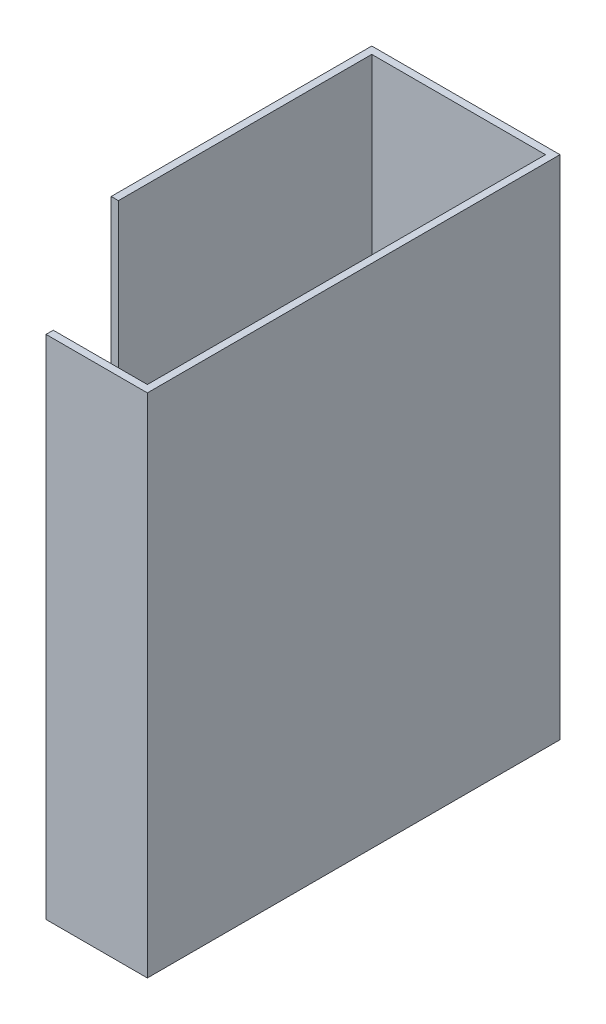
ISO-10303-21;
HEADER;
FILE_DESCRIPTION(('STEP AP214'),'2;1');
FILE_NAME('part.step','',(''),(''),'','','');
FILE_SCHEMA(('AUTOMOTIVE_DESIGN { 1 0 10303 214 1 1 1 1 }'));
ENDSEC;
DATA;
#1=APPLICATION_CONTEXT('core data for automotive mechanical design processes');
#2=APPLICATION_PROTOCOL_DEFINITION('international standard','automotive_design',2000,#1);
#3=PRODUCT_CONTEXT('',#1,'mechanical');
#4=PRODUCT('Part','Part','',(#3));
#5=PRODUCT_RELATED_PRODUCT_CATEGORY('part','',(#4));
#6=PRODUCT_DEFINITION_FORMATION('','',#4);
#7=PRODUCT_DEFINITION_CONTEXT('part definition',#1,'design');
#8=PRODUCT_DEFINITION('design','',#6,#7);
#9=PRODUCT_DEFINITION_SHAPE('','',#8);
#10=(LENGTH_UNIT() NAMED_UNIT(*) SI_UNIT(.MILLI.,.METRE.));
#11=(NAMED_UNIT(*) PLANE_ANGLE_UNIT() SI_UNIT($,.RADIAN.));
#12=(NAMED_UNIT(*) SI_UNIT($,.STERADIAN.) SOLID_ANGLE_UNIT());
#13=UNCERTAINTY_MEASURE_WITH_UNIT(LENGTH_MEASURE(1.E-05),#10,'distance_accuracy_value','');
#14=(GEOMETRIC_REPRESENTATION_CONTEXT(3) GLOBAL_UNCERTAINTY_ASSIGNED_CONTEXT((#13)) GLOBAL_UNIT_ASSIGNED_CONTEXT((#10,
#11,#12)) REPRESENTATION_CONTEXT('',''));
#15=CARTESIAN_POINT('',(0.,0.,0.));
#16=DIRECTION('',(0.,0.,1.));
#17=DIRECTION('',(1.,0.,0.));
#18=AXIS2_PLACEMENT_3D('',#15,#16,#17);
#19=CARTESIAN_POINT('',(-140.,700.,0.));
#20=DIRECTION('',(0.,0.,-1.));
#21=DIRECTION('',(-1.,0.,0.));
#22=AXIS2_PLACEMENT_3D('',#19,#20,#21);
#23=PLANE('',#22);
#24=DIRECTION('',(1.,0.,0.));
#25=VECTOR('',#24,1.);
#26=CARTESIAN_POINT('',(-140.,0.,0.));
#27=LINE('',#26,#25);
#28=CARTESIAN_POINT('',(-140.,0.,0.));
#29=VERTEX_POINT('',#28);
#30=CARTESIAN_POINT('',(0.,0.,0.));
#31=VERTEX_POINT('',#30);
#32=EDGE_CURVE('E145',#29,#31,#27,.T.);
#33=ORIENTED_EDGE('',*,*,#32,.T.);
#34=DIRECTION('',(0.,-1.,0.));
#35=VECTOR('',#34,1.);
#36=CARTESIAN_POINT('',(0.,700.,0.));
#37=LINE('',#36,#35);
#38=CARTESIAN_POINT('',(0.,700.,0.));
#39=VERTEX_POINT('',#38);
#40=EDGE_CURVE('E11',#39,#31,#37,.T.);
#41=ORIENTED_EDGE('',*,*,#40,.F.);
#42=DIRECTION('',(1.,0.,0.));
#43=VECTOR('',#42,1.);
#44=CARTESIAN_POINT('',(-140.,700.,0.));
#45=LINE('',#44,#43);
#46=CARTESIAN_POINT('',(-140.,700.,0.));
#47=VERTEX_POINT('',#46);
#48=EDGE_CURVE('E163',#47,#39,#45,.T.);
#49=ORIENTED_EDGE('',*,*,#48,.F.);
#50=DIRECTION('',(0.,-1.,0.));
#51=VECTOR('',#50,1.);
#52=CARTESIAN_POINT('',(-140.,700.,0.));
#53=LINE('',#52,#51);
#54=EDGE_CURVE('E141',#47,#29,#53,.T.);
#55=ORIENTED_EDGE('',*,*,#54,.T.);
#56=EDGE_LOOP('',(#33,#41,#49,#55));
#57=FACE_BOUND('',#56,.T.);
#58=ADVANCED_FACE('F37',(#57),#23,.F.);
#59=CARTESIAN_POINT('',(0.,700.,0.));
#60=DIRECTION('',(-1.,0.,0.));
#61=DIRECTION('',(0.,0.,1.));
#62=AXIS2_PLACEMENT_3D('',#59,#60,#61);
#63=PLANE('',#62);
#64=DIRECTION('',(0.,0.,-1.));
#65=VECTOR('',#64,1.);
#66=CARTESIAN_POINT('',(0.,0.,0.));
#67=LINE('',#66,#65);
#68=CARTESIAN_POINT('',(0.,0.,-570.));
#69=VERTEX_POINT('',#68);
#70=EDGE_CURVE('E148',#31,#69,#67,.T.);
#71=ORIENTED_EDGE('',*,*,#70,.T.);
#72=DIRECTION('',(0.,-1.,0.));
#73=VECTOR('',#72,1.);
#74=CARTESIAN_POINT('',(0.,700.,-570.));
#75=LINE('',#74,#73);
#76=CARTESIAN_POINT('',(0.,700.,-570.));
#77=VERTEX_POINT('',#76);
#78=EDGE_CURVE('E45',#77,#69,#75,.T.);
#79=ORIENTED_EDGE('',*,*,#78,.F.);
#80=DIRECTION('',(0.,0.,-1.));
#81=VECTOR('',#80,1.);
#82=CARTESIAN_POINT('',(0.,700.,0.));
#83=LINE('',#82,#81);
#84=EDGE_CURVE('E102',#39,#77,#83,.T.);
#85=ORIENTED_EDGE('',*,*,#84,.F.);
#86=ORIENTED_EDGE('',*,*,#40,.T.);
#87=EDGE_LOOP('',(#71,#79,#85,#86));
#88=FACE_BOUND('',#87,.T.);
#89=ADVANCED_FACE('F212',(#88),#63,.F.);
#90=CARTESIAN_POINT('',(0.,700.,-570.));
#91=DIRECTION('',(0.,0.,1.));
#92=DIRECTION('',(1.,0.,0.));
#93=AXIS2_PLACEMENT_3D('',#90,#91,#92);
#94=PLANE('',#93);
#95=DIRECTION('',(-1.,0.,0.));
#96=VECTOR('',#95,1.);
#97=CARTESIAN_POINT('',(0.,0.,-570.));
#98=LINE('',#97,#96);
#99=CARTESIAN_POINT('',(-260.,0.,-570.));
#100=VERTEX_POINT('',#99);
#101=EDGE_CURVE('E150',#69,#100,#98,.T.);
#102=ORIENTED_EDGE('',*,*,#101,.T.);
#103=DIRECTION('',(0.,-1.,0.));
#104=VECTOR('',#103,1.);
#105=CARTESIAN_POINT('',(-260.,700.,-570.));
#106=LINE('',#105,#104);
#107=CARTESIAN_POINT('',(-260.,700.,-570.));
#108=VERTEX_POINT('',#107);
#109=EDGE_CURVE('E176',#108,#100,#106,.T.);
#110=ORIENTED_EDGE('',*,*,#109,.F.);
#111=DIRECTION('',(-1.,0.,0.));
#112=VECTOR('',#111,1.);
#113=CARTESIAN_POINT('',(0.,700.,-570.));
#114=LINE('',#113,#112);
#115=EDGE_CURVE('E184',#77,#108,#114,.T.);
#116=ORIENTED_EDGE('',*,*,#115,.F.);
#117=ORIENTED_EDGE('',*,*,#78,.T.);
#118=EDGE_LOOP('',(#102,#110,#116,#117));
#119=FACE_BOUND('',#118,.T.);
#120=ADVANCED_FACE('F182',(#119),#94,.F.);
#121=CARTESIAN_POINT('',(-260.,700.,-570.));
#122=DIRECTION('',(1.,0.,0.));
#123=DIRECTION('',(0.,0.,-1.));
#124=AXIS2_PLACEMENT_3D('',#121,#122,#123);
#125=PLANE('',#124);
#126=DIRECTION('',(0.,0.,1.));
#127=VECTOR('',#126,1.);
#128=CARTESIAN_POINT('',(-260.,0.,-570.));
#129=LINE('',#128,#127);
#130=CARTESIAN_POINT('',(-260.,0.,-210.));
#131=VERTEX_POINT('',#130);
#132=EDGE_CURVE('E152',#100,#131,#129,.T.);
#133=ORIENTED_EDGE('',*,*,#132,.T.);
#134=DIRECTION('',(0.,-1.,0.));
#135=VECTOR('',#134,1.);
#136=CARTESIAN_POINT('',(-260.,700.,-210.));
#137=LINE('',#136,#135);
#138=CARTESIAN_POINT('',(-260.,700.,-210.));
#139=VERTEX_POINT('',#138);
#140=EDGE_CURVE('E173',#139,#131,#137,.T.);
#141=ORIENTED_EDGE('',*,*,#140,.F.);
#142=DIRECTION('',(0.,0.,1.));
#143=VECTOR('',#142,1.);
#144=CARTESIAN_POINT('',(-260.,700.,-570.));
#145=LINE('',#144,#143);
#146=EDGE_CURVE('E202',#108,#139,#145,.T.);
#147=ORIENTED_EDGE('',*,*,#146,.F.);
#148=ORIENTED_EDGE('',*,*,#109,.T.);
#149=EDGE_LOOP('',(#133,#141,#147,#148));
#150=FACE_BOUND('',#149,.T.);
#151=ADVANCED_FACE('F193',(#150),#125,.F.);
#152=CARTESIAN_POINT('',(-260.,700.,-210.));
#153=DIRECTION('',(0.,0.,-1.));
#154=DIRECTION('',(-1.,0.,0.));
#155=AXIS2_PLACEMENT_3D('',#152,#153,#154);
#156=PLANE('',#155);
#157=DIRECTION('',(1.,0.,0.));
#158=VECTOR('',#157,1.);
#159=CARTESIAN_POINT('',(-260.,0.,-210.));
#160=LINE('',#159,#158);
#161=CARTESIAN_POINT('',(-250.,0.,-210.));
#162=VERTEX_POINT('',#161);
#163=EDGE_CURVE('E154',#131,#162,#160,.T.);
#164=ORIENTED_EDGE('',*,*,#163,.T.);
#165=DIRECTION('',(0.,-1.,0.));
#166=VECTOR('',#165,1.);
#167=CARTESIAN_POINT('',(-250.,700.,-210.));
#168=LINE('',#167,#166);
#169=CARTESIAN_POINT('',(-250.,700.,-210.));
#170=VERTEX_POINT('',#169);
#171=EDGE_CURVE('E170',#170,#162,#168,.T.);
#172=ORIENTED_EDGE('',*,*,#171,.F.);
#173=DIRECTION('',(1.,0.,0.));
#174=VECTOR('',#173,1.);
#175=CARTESIAN_POINT('',(-260.,700.,-210.));
#176=LINE('',#175,#174);
#177=EDGE_CURVE('E199',#139,#170,#176,.T.);
#178=ORIENTED_EDGE('',*,*,#177,.F.);
#179=ORIENTED_EDGE('',*,*,#140,.T.);
#180=EDGE_LOOP('',(#164,#172,#178,#179));
#181=FACE_BOUND('',#180,.T.);
#182=ADVANCED_FACE('F197',(#181),#156,.F.);
#183=CARTESIAN_POINT('',(-250.,700.,-210.));
#184=DIRECTION('',(-1.,0.,0.));
#185=DIRECTION('',(0.,0.,1.));
#186=AXIS2_PLACEMENT_3D('',#183,#184,#185);
#187=PLANE('',#186);
#188=DIRECTION('',(0.,0.,-1.));
#189=VECTOR('',#188,1.);
#190=CARTESIAN_POINT('',(-250.,0.,-210.));
#191=LINE('',#190,#189);
#192=CARTESIAN_POINT('',(-250.,0.,-560.));
#193=VERTEX_POINT('',#192);
#194=EDGE_CURVE('E156',#162,#193,#191,.T.);
#195=ORIENTED_EDGE('',*,*,#194,.T.);
#196=DIRECTION('',(0.,-1.,0.));
#197=VECTOR('',#196,1.);
#198=CARTESIAN_POINT('',(-250.,700.,-560.));
#199=LINE('',#198,#197);
#200=CARTESIAN_POINT('',(-250.,700.,-560.));
#201=VERTEX_POINT('',#200);
#202=EDGE_CURVE('E167',#201,#193,#199,.T.);
#203=ORIENTED_EDGE('',*,*,#202,.F.);
#204=DIRECTION('',(0.,0.,-1.));
#205=VECTOR('',#204,1.);
#206=CARTESIAN_POINT('',(-250.,700.,-210.));
#207=LINE('',#206,#205);
#208=EDGE_CURVE('E201',#170,#201,#207,.T.);
#209=ORIENTED_EDGE('',*,*,#208,.F.);
#210=ORIENTED_EDGE('',*,*,#171,.T.);
#211=EDGE_LOOP('',(#195,#203,#209,#210));
#212=FACE_BOUND('',#211,.T.);
#213=ADVANCED_FACE('F224',(#212),#187,.F.);
#214=CARTESIAN_POINT('',(-250.,700.,-560.));
#215=DIRECTION('',(0.,0.,-1.));
#216=DIRECTION('',(-1.,0.,0.));
#217=AXIS2_PLACEMENT_3D('',#214,#215,#216);
#218=PLANE('',#217);
#219=DIRECTION('',(1.,0.,0.));
#220=VECTOR('',#219,1.);
#221=CARTESIAN_POINT('',(-250.,0.,-560.));
#222=LINE('',#221,#220);
#223=CARTESIAN_POINT('',(-10.,0.,-560.));
#224=VERTEX_POINT('',#223);
#225=EDGE_CURVE('E158',#193,#224,#222,.T.);
#226=ORIENTED_EDGE('',*,*,#225,.T.);
#227=DIRECTION('',(0.,-1.,0.));
#228=VECTOR('',#227,1.);
#229=CARTESIAN_POINT('',(-10.,700.,-560.));
#230=LINE('',#229,#228);
#231=CARTESIAN_POINT('',(-10.,700.,-560.));
#232=VERTEX_POINT('',#231);
#233=EDGE_CURVE('E136',#232,#224,#230,.T.);
#234=ORIENTED_EDGE('',*,*,#233,.F.);
#235=DIRECTION('',(1.,0.,0.));
#236=VECTOR('',#235,1.);
#237=CARTESIAN_POINT('',(-250.,700.,-560.));
#238=LINE('',#237,#236);
#239=EDGE_CURVE('E127',#201,#232,#238,.T.);
#240=ORIENTED_EDGE('',*,*,#239,.F.);
#241=ORIENTED_EDGE('',*,*,#202,.T.);
#242=EDGE_LOOP('',(#226,#234,#240,#241));
#243=FACE_BOUND('',#242,.T.);
#244=ADVANCED_FACE('F227',(#243),#218,.F.);
#245=CARTESIAN_POINT('',(-10.,700.,-560.));
#246=DIRECTION('',(1.,0.,0.));
#247=DIRECTION('',(0.,0.,-1.));
#248=AXIS2_PLACEMENT_3D('',#245,#246,#247);
#249=PLANE('',#248);
#250=DIRECTION('',(0.,0.,1.));
#251=VECTOR('',#250,1.);
#252=CARTESIAN_POINT('',(-10.,0.,-560.));
#253=LINE('',#252,#251);
#254=CARTESIAN_POINT('',(-9.99999999999993,0.,-10.));
#255=VERTEX_POINT('',#254);
#256=EDGE_CURVE('E135',#224,#255,#253,.T.);
#257=ORIENTED_EDGE('',*,*,#256,.T.);
#258=DIRECTION('',(0.,-1.,0.));
#259=VECTOR('',#258,1.);
#260=CARTESIAN_POINT('',(-9.99999999999993,700.,-10.));
#261=LINE('',#260,#259);
#262=CARTESIAN_POINT('',(-9.99999999999993,700.,-10.));
#263=VERTEX_POINT('',#262);
#264=EDGE_CURVE('E132',#263,#255,#261,.T.);
#265=ORIENTED_EDGE('',*,*,#264,.F.);
#266=DIRECTION('',(0.,0.,1.));
#267=VECTOR('',#266,1.);
#268=CARTESIAN_POINT('',(-10.,700.,-560.));
#269=LINE('',#268,#267);
#270=EDGE_CURVE('E121',#232,#263,#269,.T.);
#271=ORIENTED_EDGE('',*,*,#270,.F.);
#272=ORIENTED_EDGE('',*,*,#233,.T.);
#273=EDGE_LOOP('',(#257,#265,#271,#272));
#274=FACE_BOUND('',#273,.T.);
#275=ADVANCED_FACE('F133',(#274),#249,.F.);
#276=CARTESIAN_POINT('',(-9.99999999999993,700.,-10.));
#277=DIRECTION('',(0.,0.,1.));
#278=DIRECTION('',(1.,0.,0.));
#279=AXIS2_PLACEMENT_3D('',#276,#277,#278);
#280=PLANE('',#279);
#281=DIRECTION('',(-1.,0.,0.));
#282=VECTOR('',#281,1.);
#283=CARTESIAN_POINT('',(-9.99999999999993,0.,-10.));
#284=LINE('',#283,#282);
#285=CARTESIAN_POINT('',(-140.,0.,-9.99999999999998));
#286=VERTEX_POINT('',#285);
#287=EDGE_CURVE('E88',#255,#286,#284,.T.);
#288=ORIENTED_EDGE('',*,*,#287,.T.);
#289=DIRECTION('',(0.,-1.,0.));
#290=VECTOR('',#289,1.);
#291=CARTESIAN_POINT('',(-140.,700.,-9.99999999999998));
#292=LINE('',#291,#290);
#293=CARTESIAN_POINT('',(-140.,700.,-9.99999999999998));
#294=VERTEX_POINT('',#293);
#295=EDGE_CURVE('E137',#294,#286,#292,.T.);
#296=ORIENTED_EDGE('',*,*,#295,.F.);
#297=DIRECTION('',(-1.,0.,0.));
#298=VECTOR('',#297,1.);
#299=CARTESIAN_POINT('',(-9.99999999999993,700.,-10.));
#300=LINE('',#299,#298);
#301=EDGE_CURVE('E125',#263,#294,#300,.T.);
#302=ORIENTED_EDGE('',*,*,#301,.F.);
#303=ORIENTED_EDGE('',*,*,#264,.T.);
#304=EDGE_LOOP('',(#288,#296,#302,#303));
#305=FACE_BOUND('',#304,.T.);
#306=ADVANCED_FACE('F139',(#305),#280,.F.);
#307=CARTESIAN_POINT('',(-140.,700.,-9.99999999999998));
#308=DIRECTION('',(1.,0.,0.));
#309=DIRECTION('',(0.,0.,-1.));
#310=AXIS2_PLACEMENT_3D('',#307,#308,#309);
#311=PLANE('',#310);
#312=DIRECTION('',(0.,0.,1.));
#313=VECTOR('',#312,1.);
#314=CARTESIAN_POINT('',(-140.,0.,-9.99999999999998));
#315=LINE('',#314,#313);
#316=EDGE_CURVE('E94',#286,#29,#315,.T.);
#317=ORIENTED_EDGE('',*,*,#316,.T.);
#318=ORIENTED_EDGE('',*,*,#54,.F.);
#319=DIRECTION('',(0.,0.,1.));
#320=VECTOR('',#319,1.);
#321=CARTESIAN_POINT('',(-140.,700.,-9.99999999999998));
#322=LINE('',#321,#320);
#323=EDGE_CURVE('E53',#294,#47,#322,.T.);
#324=ORIENTED_EDGE('',*,*,#323,.F.);
#325=ORIENTED_EDGE('',*,*,#295,.T.);
#326=EDGE_LOOP('',(#317,#318,#324,#325));
#327=FACE_BOUND('',#326,.T.);
#328=ADVANCED_FACE('F236',(#327),#311,.F.);
#329=CARTESIAN_POINT('',(0.,700.,0.));
#330=DIRECTION('',(0.,1.,0.));
#331=DIRECTION('',(0.,0.,1.));
#332=AXIS2_PLACEMENT_3D('',#329,#330,#331);
#333=PLANE('',#332);
#334=ORIENTED_EDGE('',*,*,#48,.T.);
#335=ORIENTED_EDGE('',*,*,#84,.T.);
#336=ORIENTED_EDGE('',*,*,#115,.T.);
#337=ORIENTED_EDGE('',*,*,#146,.T.);
#338=ORIENTED_EDGE('',*,*,#177,.T.);
#339=ORIENTED_EDGE('',*,*,#208,.T.);
#340=ORIENTED_EDGE('',*,*,#239,.T.);
#341=ORIENTED_EDGE('',*,*,#270,.T.);
#342=ORIENTED_EDGE('',*,*,#301,.T.);
#343=ORIENTED_EDGE('',*,*,#323,.T.);
#344=EDGE_LOOP('',(#334,#335,#336,#337,#338,#339,#340,#341,#342,#343));
#345=FACE_BOUND('',#344,.T.);
#346=ADVANCED_FACE('F123',(#345),#333,.T.);
#347=CARTESIAN_POINT('',(0.,0.,0.));
#348=DIRECTION('',(0.,1.,0.));
#349=DIRECTION('',(0.,0.,1.));
#350=AXIS2_PLACEMENT_3D('',#347,#348,#349);
#351=PLANE('',#350);
#352=ORIENTED_EDGE('',*,*,#32,.F.);
#353=ORIENTED_EDGE('',*,*,#316,.F.);
#354=ORIENTED_EDGE('',*,*,#287,.F.);
#355=ORIENTED_EDGE('',*,*,#256,.F.);
#356=ORIENTED_EDGE('',*,*,#225,.F.);
#357=ORIENTED_EDGE('',*,*,#194,.F.);
#358=ORIENTED_EDGE('',*,*,#163,.F.);
#359=ORIENTED_EDGE('',*,*,#132,.F.);
#360=ORIENTED_EDGE('',*,*,#101,.F.);
#361=ORIENTED_EDGE('',*,*,#70,.F.);
#362=EDGE_LOOP('',(#352,#353,#354,#355,#356,#357,#358,#359,#360,#361));
#363=FACE_BOUND('',#362,.T.);
#364=ADVANCED_FACE('F188',(#363),#351,.F.);
#365=CLOSED_SHELL('',(#58,#89,#120,#151,#182,#213,#244,#275,#306,#328,#346,#364));
#366=MANIFOLD_SOLID_BREP('B2',#365);
#367=ADVANCED_BREP_SHAPE_REPRESENTATION('',(#18,#366),#14);
#368=SHAPE_DEFINITION_REPRESENTATION(#9,#367);
ENDSEC;
END-ISO-10303-21;
